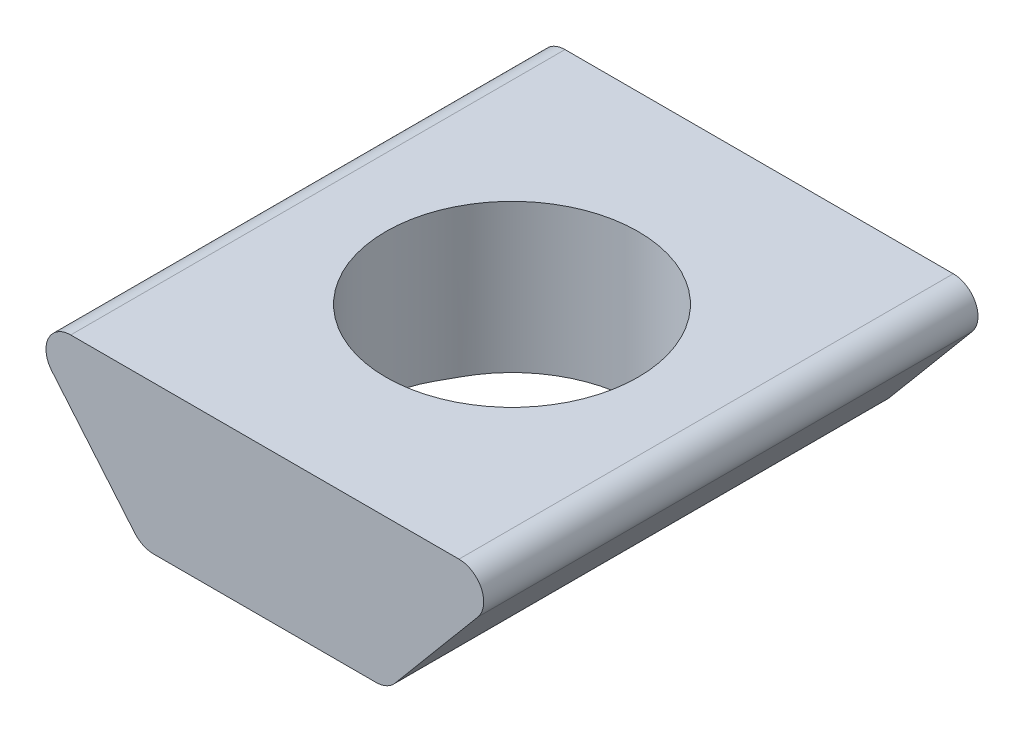
ISO-10303-21;
HEADER;
FILE_DESCRIPTION(('STEP AP214'),'2;1');
FILE_NAME('part.step','',(''),(''),'','','');
FILE_SCHEMA(('AUTOMOTIVE_DESIGN { 1 0 10303 214 1 1 1 1 }'));
ENDSEC;
DATA;
#1=APPLICATION_CONTEXT('core data for automotive mechanical design processes');
#2=APPLICATION_PROTOCOL_DEFINITION('international standard','automotive_design',2000,#1);
#3=PRODUCT_CONTEXT('',#1,'mechanical');
#4=PRODUCT('Part','Part','',(#3));
#5=PRODUCT_RELATED_PRODUCT_CATEGORY('part','',(#4));
#6=PRODUCT_DEFINITION_FORMATION('','',#4);
#7=PRODUCT_DEFINITION_CONTEXT('part definition',#1,'design');
#8=PRODUCT_DEFINITION('design','',#6,#7);
#9=PRODUCT_DEFINITION_SHAPE('','',#8);
#10=(LENGTH_UNIT() NAMED_UNIT(*) SI_UNIT(.MILLI.,.METRE.));
#11=(NAMED_UNIT(*) PLANE_ANGLE_UNIT() SI_UNIT($,.RADIAN.));
#12=(NAMED_UNIT(*) SI_UNIT($,.STERADIAN.) SOLID_ANGLE_UNIT());
#13=UNCERTAINTY_MEASURE_WITH_UNIT(LENGTH_MEASURE(1.E-05),#10,'distance_accuracy_value','');
#14=(GEOMETRIC_REPRESENTATION_CONTEXT(3) GLOBAL_UNCERTAINTY_ASSIGNED_CONTEXT((#13)) GLOBAL_UNIT_ASSIGNED_CONTEXT((#10,
#11,#12)) REPRESENTATION_CONTEXT('',''));
#15=CARTESIAN_POINT('',(0.,0.,0.));
#16=DIRECTION('',(0.,0.,1.));
#17=DIRECTION('',(1.,0.,0.));
#18=AXIS2_PLACEMENT_3D('',#15,#16,#17);
#19=CARTESIAN_POINT('',(2.48270110646813,-3.,10.));
#20=DIRECTION('',(0.,1.,0.));
#21=DIRECTION('',(-1.,0.,0.));
#22=AXIS2_PLACEMENT_3D('',#19,#20,#21);
#23=PLANE('',#22);
#24=DIRECTION('',(1.,0.,0.));
#25=VECTOR('',#24,1.);
#26=CARTESIAN_POINT('',(2.48270110646813,-3.,0.));
#27=LINE('',#26,#25);
#28=CARTESIAN_POINT('',(-2.24954727739063,-3.,0.));
#29=VERTEX_POINT('',#28);
#30=CARTESIAN_POINT('',(2.24954727739063,-3.,0.));
#31=VERTEX_POINT('',#30);
#32=EDGE_CURVE('E159',#29,#31,#27,.T.);
#33=ORIENTED_EDGE('',*,*,#32,.T.);
#34=DIRECTION('',(0.,0.,-1.));
#35=VECTOR('',#34,1.);
#36=CARTESIAN_POINT('',(2.24954727739063,-3.,1.89671434278934));
#37=LINE('',#36,#35);
#38=CARTESIAN_POINT('',(2.24954727739063,-3.,3.79342868557868));
#39=VERTEX_POINT('',#38);
#40=EDGE_CURVE('E124',#31,#39,#37,.F.);
#41=ORIENTED_EDGE('',*,*,#40,.T.);
#42=CARTESIAN_POINT('',(0.,-3.,5.));
#43=DIRECTION('',(0.,1.,0.));
#44=DIRECTION('',(0.,0.,1.));
#45=AXIS2_PLACEMENT_3D('',#42,#43,#44);
#46=CIRCLE('',#45,2.5527);
#47=CARTESIAN_POINT('',(-2.24954727739063,-3.,3.79342868557868));
#48=VERTEX_POINT('',#47);
#49=EDGE_CURVE('E161',#39,#48,#46,.T.);
#50=ORIENTED_EDGE('',*,*,#49,.T.);
#51=DIRECTION('',(0.,0.,-1.));
#52=VECTOR('',#51,1.);
#53=CARTESIAN_POINT('',(-2.24954727739063,-3.,1.89671434278934));
#54=LINE('',#53,#52);
#55=EDGE_CURVE('E129',#48,#29,#54,.T.);
#56=ORIENTED_EDGE('',*,*,#55,.T.);
#57=EDGE_LOOP('',(#33,#41,#50,#56));
#58=FACE_BOUND('',#57,.T.);
#59=ADVANCED_FACE('F39',(#58),#23,.F.);
#60=CARTESIAN_POINT('',(5.,0.,10.));
#61=DIRECTION('',(-0.766044443118974,0.642787609686544,0.));
#62=DIRECTION('',(-0.642787609686544,-0.766044443118974,0.));
#63=AXIS2_PLACEMENT_3D('',#60,#61,#62);
#64=PLANE('',#63);
#65=DIRECTION('',(0.642787609686543,0.766044443118974,0.));
#66=VECTOR('',#65,1.);
#67=CARTESIAN_POINT('',(5.,0.,10.));
#68=LINE('',#67,#66);
#69=CARTESIAN_POINT('',(2.63256949895012,-2.82139380484327,10.));
#70=VERTEX_POINT('',#69);
#71=CARTESIAN_POINT('',(4.3107687613047,-0.821393804843272,10.));
#72=VERTEX_POINT('',#71);
#73=EDGE_CURVE('E139',#70,#72,#68,.T.);
#74=ORIENTED_EDGE('',*,*,#73,.F.);
#75=DIRECTION('',(0.,0.,-1.));
#76=VECTOR('',#75,1.);
#77=CARTESIAN_POINT('',(2.63256949895012,-2.82139380484327,10.));
#78=LINE('',#77,#76);
#79=CARTESIAN_POINT('',(2.63256949895012,-2.82139380484327,0.));
#80=VERTEX_POINT('',#79);
#81=EDGE_CURVE('E122',#70,#80,#78,.T.);
#82=ORIENTED_EDGE('',*,*,#81,.T.);
#83=DIRECTION('',(0.642787609686543,0.766044443118974,0.));
#84=VECTOR('',#83,1.);
#85=CARTESIAN_POINT('',(5.,0.,0.));
#86=LINE('',#85,#84);
#87=CARTESIAN_POINT('',(4.3107687613047,-0.821393804843272,0.));
#88=VERTEX_POINT('',#87);
#89=EDGE_CURVE('E136',#80,#88,#86,.T.);
#90=ORIENTED_EDGE('',*,*,#89,.T.);
#91=DIRECTION('',(0.,0.,-1.));
#92=VECTOR('',#91,1.);
#93=CARTESIAN_POINT('',(4.3107687613047,-0.821393804843272,10.));
#94=LINE('',#93,#92);
#95=EDGE_CURVE('E141',#88,#72,#94,.F.);
#96=ORIENTED_EDGE('',*,*,#95,.T.);
#97=EDGE_LOOP('',(#74,#82,#90,#96));
#98=FACE_BOUND('',#97,.T.);
#99=ADVANCED_FACE('F135',(#98),#64,.F.);
#100=CARTESIAN_POINT('',(-5.,0.,10.));
#101=DIRECTION('',(0.,-1.,0.));
#102=DIRECTION('',(0.,0.,-1.));
#103=AXIS2_PLACEMENT_3D('',#100,#101,#102);
#104=PLANE('',#103);
#105=CARTESIAN_POINT('',(0.,0.,5.));
#106=DIRECTION('',(0.,1.,0.));
#107=DIRECTION('',(0.,0.,1.));
#108=AXIS2_PLACEMENT_3D('',#105,#106,#107);
#109=CIRCLE('',#108,2.5527);
#110=CARTESIAN_POINT('',(0.,0.,7.5527));
#111=VERTEX_POINT('',#110);
#112=EDGE_CURVE('E147',#111,#111,#109,.T.);
#113=ORIENTED_EDGE('',*,*,#112,.F.);
#114=EDGE_LOOP('',(#113));
#115=FACE_BOUND('',#114,.T.);
#116=DIRECTION('',(-1.,0.,0.));
#117=VECTOR('',#116,1.);
#118=CARTESIAN_POINT('',(-5.,0.,10.));
#119=LINE('',#118,#117);
#120=CARTESIAN_POINT('',(3.92774653974521,0.,10.));
#121=VERTEX_POINT('',#120);
#122=CARTESIAN_POINT('',(-3.92774653974521,0.,10.));
#123=VERTEX_POINT('',#122);
#124=EDGE_CURVE('E251',#121,#123,#119,.T.);
#125=ORIENTED_EDGE('',*,*,#124,.F.);
#126=DIRECTION('',(0.,0.,-1.));
#127=VECTOR('',#126,1.);
#128=CARTESIAN_POINT('',(3.92774653974521,0.,10.));
#129=LINE('',#128,#127);
#130=CARTESIAN_POINT('',(3.92774653974521,0.,0.));
#131=VERTEX_POINT('',#130);
#132=EDGE_CURVE('E11',#121,#131,#129,.T.);
#133=ORIENTED_EDGE('',*,*,#132,.T.);
#134=DIRECTION('',(-1.,0.,0.));
#135=VECTOR('',#134,1.);
#136=CARTESIAN_POINT('',(-5.,0.,0.));
#137=LINE('',#136,#135);
#138=CARTESIAN_POINT('',(-3.92774653974521,0.,0.));
#139=VERTEX_POINT('',#138);
#140=EDGE_CURVE('E146',#131,#139,#137,.T.);
#141=ORIENTED_EDGE('',*,*,#140,.T.);
#142=DIRECTION('',(0.,0.,-1.));
#143=VECTOR('',#142,1.);
#144=CARTESIAN_POINT('',(-3.92774653974521,0.,10.));
#145=LINE('',#144,#143);
#146=EDGE_CURVE('E47',#139,#123,#145,.F.);
#147=ORIENTED_EDGE('',*,*,#146,.T.);
#148=EDGE_LOOP('',(#125,#133,#141,#147));
#149=FACE_BOUND('',#148,.T.);
#150=ADVANCED_FACE('F203',(#115,#149),#104,.F.);
#151=CARTESIAN_POINT('',(-2.48270110646813,-3.,10.));
#152=DIRECTION('',(0.766044443118974,0.642787609686544,0.));
#153=DIRECTION('',(-0.642787609686544,0.766044443118974,0.));
#154=AXIS2_PLACEMENT_3D('',#151,#152,#153);
#155=PLANE('',#154);
#156=DIRECTION('',(0.642787609686544,-0.766044443118974,0.));
#157=VECTOR('',#156,1.);
#158=CARTESIAN_POINT('',(-2.48270110646813,-3.,0.));
#159=LINE('',#158,#157);
#160=CARTESIAN_POINT('',(-4.3107687613047,-0.821393804843272,0.));
#161=VERTEX_POINT('',#160);
#162=CARTESIAN_POINT('',(-2.63256949895012,-2.82139380484327,0.));
#163=VERTEX_POINT('',#162);
#164=EDGE_CURVE('E150',#161,#163,#159,.T.);
#165=ORIENTED_EDGE('',*,*,#164,.T.);
#166=DIRECTION('',(0.,0.,-1.));
#167=VECTOR('',#166,1.);
#168=CARTESIAN_POINT('',(-2.63256949895012,-2.82139380484327,10.));
#169=LINE('',#168,#167);
#170=CARTESIAN_POINT('',(-2.63256949895012,-2.82139380484327,10.));
#171=VERTEX_POINT('',#170);
#172=EDGE_CURVE('E54',#163,#171,#169,.F.);
#173=ORIENTED_EDGE('',*,*,#172,.T.);
#174=DIRECTION('',(0.642787609686544,-0.766044443118974,0.));
#175=VECTOR('',#174,1.);
#176=CARTESIAN_POINT('',(-2.48270110646813,-3.,10.));
#177=LINE('',#176,#175);
#178=CARTESIAN_POINT('',(-4.3107687613047,-0.821393804843272,10.));
#179=VERTEX_POINT('',#178);
#180=EDGE_CURVE('E250',#179,#171,#177,.T.);
#181=ORIENTED_EDGE('',*,*,#180,.F.);
#182=DIRECTION('',(0.,0.,-1.));
#183=VECTOR('',#182,1.);
#184=CARTESIAN_POINT('',(-4.3107687613047,-0.821393804843272,10.));
#185=LINE('',#184,#183);
#186=EDGE_CURVE('E227',#179,#161,#185,.T.);
#187=ORIENTED_EDGE('',*,*,#186,.T.);
#188=EDGE_LOOP('',(#165,#173,#181,#187));
#189=FACE_BOUND('',#188,.T.);
#190=ADVANCED_FACE('F199',(#189),#155,.F.);
#191=CARTESIAN_POINT('',(-2.24954727739063,-3.,6.20657131442132));
#192=VERTEX_POINT('',#191);
#193=CARTESIAN_POINT('',(2.24954727739063,-3.,6.20657131442132));
#194=VERTEX_POINT('',#193);
#195=EDGE_CURVE('E245',#192,#194,#46,.T.);
#196=ORIENTED_EDGE('',*,*,#195,.T.);
#197=DIRECTION('',(0.,0.,-1.));
#198=VECTOR('',#197,1.);
#199=CARTESIAN_POINT('',(2.24954727739063,-3.,10.));
#200=LINE('',#199,#198);
#201=CARTESIAN_POINT('',(2.24954727739063,-3.,10.));
#202=VERTEX_POINT('',#201);
#203=EDGE_CURVE('E238',#194,#202,#200,.F.);
#204=ORIENTED_EDGE('',*,*,#203,.T.);
#205=DIRECTION('',(1.,0.,0.));
#206=VECTOR('',#205,1.);
#207=CARTESIAN_POINT('',(2.48270110646813,-3.,10.));
#208=LINE('',#207,#206);
#209=CARTESIAN_POINT('',(-2.24954727739063,-3.,10.));
#210=VERTEX_POINT('',#209);
#211=EDGE_CURVE('E155',#210,#202,#208,.T.);
#212=ORIENTED_EDGE('',*,*,#211,.F.);
#213=DIRECTION('',(0.,0.,-1.));
#214=VECTOR('',#213,1.);
#215=CARTESIAN_POINT('',(-2.24954727739063,-3.,10.));
#216=LINE('',#215,#214);
#217=EDGE_CURVE('E239',#210,#192,#216,.T.);
#218=ORIENTED_EDGE('',*,*,#217,.T.);
#219=EDGE_LOOP('',(#196,#204,#212,#218));
#220=FACE_BOUND('',#219,.T.);
#221=ADVANCED_FACE('F194',(#220),#23,.F.);
#222=CARTESIAN_POINT('',(0.,0.,10.));
#223=DIRECTION('',(0.,0.,-1.));
#224=DIRECTION('',(-1.,0.,0.));
#225=AXIS2_PLACEMENT_3D('',#222,#223,#224);
#226=PLANE('',#225);
#227=ORIENTED_EDGE('',*,*,#211,.T.);
#228=CARTESIAN_POINT('',(2.24954727739063,-2.5,10.));
#229=DIRECTION('',(0.,0.,-1.));
#230=DIRECTION('',(-1.,0.,0.));
#231=AXIS2_PLACEMENT_3D('',#228,#229,#230);
#232=CIRCLE('',#231,0.5);
#233=EDGE_CURVE('E230',#202,#70,#232,.F.);
#234=ORIENTED_EDGE('',*,*,#233,.T.);
#235=ORIENTED_EDGE('',*,*,#73,.T.);
#236=CARTESIAN_POINT('',(3.92774653974521,-0.5,10.));
#237=DIRECTION('',(0.,0.,-1.));
#238=DIRECTION('',(-1.,0.,0.));
#239=AXIS2_PLACEMENT_3D('',#236,#237,#238);
#240=CIRCLE('',#239,0.5);
#241=EDGE_CURVE('E235',#72,#121,#240,.F.);
#242=ORIENTED_EDGE('',*,*,#241,.T.);
#243=ORIENTED_EDGE('',*,*,#124,.T.);
#244=CARTESIAN_POINT('',(-3.92774653974521,-0.5,10.));
#245=DIRECTION('',(0.,0.,-1.));
#246=DIRECTION('',(-1.,0.,0.));
#247=AXIS2_PLACEMENT_3D('',#244,#245,#246);
#248=CIRCLE('',#247,0.5);
#249=EDGE_CURVE('E61',#123,#179,#248,.F.);
#250=ORIENTED_EDGE('',*,*,#249,.T.);
#251=ORIENTED_EDGE('',*,*,#180,.T.);
#252=CARTESIAN_POINT('',(-2.24954727739063,-2.5,10.));
#253=DIRECTION('',(0.,0.,-1.));
#254=DIRECTION('',(-1.,0.,0.));
#255=AXIS2_PLACEMENT_3D('',#252,#253,#254);
#256=CIRCLE('',#255,0.5);
#257=EDGE_CURVE('E226',#171,#210,#256,.F.);
#258=ORIENTED_EDGE('',*,*,#257,.T.);
#259=EDGE_LOOP('',(#227,#234,#235,#242,#243,#250,#251,#258));
#260=FACE_BOUND('',#259,.T.);
#261=ADVANCED_FACE('F190',(#260),#226,.F.);
#262=CARTESIAN_POINT('',(0.,0.,0.));
#263=DIRECTION('',(0.,0.,-1.));
#264=DIRECTION('',(-1.,0.,0.));
#265=AXIS2_PLACEMENT_3D('',#262,#263,#264);
#266=PLANE('',#265);
#267=ORIENTED_EDGE('',*,*,#89,.F.);
#268=CARTESIAN_POINT('',(2.24954727739063,-2.5,0.));
#269=DIRECTION('',(0.,0.,-1.));
#270=DIRECTION('',(-1.,0.,0.));
#271=AXIS2_PLACEMENT_3D('',#268,#269,#270);
#272=CIRCLE('',#271,0.5);
#273=EDGE_CURVE('E118',#80,#31,#272,.T.);
#274=ORIENTED_EDGE('',*,*,#273,.T.);
#275=ORIENTED_EDGE('',*,*,#32,.F.);
#276=CARTESIAN_POINT('',(-2.24954727739063,-2.5,0.));
#277=DIRECTION('',(0.,0.,-1.));
#278=DIRECTION('',(-1.,0.,0.));
#279=AXIS2_PLACEMENT_3D('',#276,#277,#278);
#280=CIRCLE('',#279,0.5);
#281=EDGE_CURVE('E130',#29,#163,#280,.T.);
#282=ORIENTED_EDGE('',*,*,#281,.T.);
#283=ORIENTED_EDGE('',*,*,#164,.F.);
#284=CARTESIAN_POINT('',(-3.92774653974521,-0.5,0.));
#285=DIRECTION('',(0.,0.,-1.));
#286=DIRECTION('',(-1.,0.,0.));
#287=AXIS2_PLACEMENT_3D('',#284,#285,#286);
#288=CIRCLE('',#287,0.5);
#289=EDGE_CURVE('E140',#161,#139,#288,.T.);
#290=ORIENTED_EDGE('',*,*,#289,.T.);
#291=ORIENTED_EDGE('',*,*,#140,.F.);
#292=CARTESIAN_POINT('',(3.92774653974521,-0.5,0.));
#293=DIRECTION('',(0.,0.,-1.));
#294=DIRECTION('',(-1.,0.,0.));
#295=AXIS2_PLACEMENT_3D('',#292,#293,#294);
#296=CIRCLE('',#295,0.5);
#297=EDGE_CURVE('E145',#131,#88,#296,.T.);
#298=ORIENTED_EDGE('',*,*,#297,.T.);
#299=EDGE_LOOP('',(#267,#274,#275,#282,#283,#290,#291,#298));
#300=FACE_BOUND('',#299,.T.);
#301=ADVANCED_FACE('F143',(#300),#266,.T.);
#302=CARTESIAN_POINT('',(0.,0.,5.));
#303=DIRECTION('',(0.,1.,0.));
#304=DIRECTION('',(0.,0.,1.));
#305=AXIS2_PLACEMENT_3D('',#302,#303,#304);
#306=CYLINDRICAL_SURFACE('',#305,2.5527);
#307=ORIENTED_EDGE('',*,*,#112,.T.);
#308=EDGE_LOOP('',(#307));
#309=FACE_BOUND('',#308,.T.);
#310=ORIENTED_EDGE('',*,*,#49,.F.);
#311=CARTESIAN_POINT('',(2.24954727739063,-3.,3.79342868557868));
#312=CARTESIAN_POINT('',(2.26394333269422,-2.99999616646399,3.82026775677088));
#313=CARTESIAN_POINT('',(2.27785283940401,-2.99937878175297,3.84735513824156));
#314=CARTESIAN_POINT('',(2.30467322681855,-2.99713473155878,3.90196407292806));
#315=CARTESIAN_POINT('',(2.3175845800956,-2.99550854702044,3.92948541316438));
#316=CARTESIAN_POINT('',(2.35475261650152,-2.98945039602383,4.01253286015282));
#317=CARTESIAN_POINT('',(2.37750190025478,-2.98383704407472,4.06865182302734));
#318=CARTESIAN_POINT('',(2.41902821818082,-2.97090485578815,4.18251766707894));
#319=CARTESIAN_POINT('',(2.43778010202598,-2.96357579671352,4.2402724065789));
#320=CARTESIAN_POINT('',(2.47112797255901,-2.94859352905436,4.35696935467399));
#321=CARTESIAN_POINT('',(2.48572119644286,-2.94094010884039,4.41591232496174));
#322=CARTESIAN_POINT('',(2.51163831828933,-2.9260854617955,4.53932541380912));
#323=CARTESIAN_POINT('',(2.52263020160855,-2.91896258867281,4.60387560582954));
#324=CARTESIAN_POINT('',(2.53963270626796,-2.90737959529724,4.73385298841238));
#325=CARTESIAN_POINT('',(2.54564564057167,-2.9029182389102,4.79927975739154));
#326=CARTESIAN_POINT('',(2.55258769929953,-2.89772694141458,4.93030194156086));
#327=CARTESIAN_POINT('',(2.55353693864029,-2.89698223711581,4.99589565235497));
#328=CARTESIAN_POINT('',(2.55038632246802,-2.89937335924134,5.12689076829201));
#329=CARTESIAN_POINT('',(2.54628591369394,-2.90250961087994,5.1922921515757));
#330=CARTESIAN_POINT('',(2.53356094432142,-2.91157109604914,5.31788918199906));
#331=CARTESIAN_POINT('',(2.52526599216346,-2.91729027465849,5.37813419947086));
#332=CARTESIAN_POINT('',(2.50444431817574,-2.9303222076145,5.49772158883407));
#333=CARTESIAN_POINT('',(2.49191483904816,-2.93763599918394,5.5570633461926));
#334=CARTESIAN_POINT('',(2.44803216005291,-2.96009702168079,5.73355435076077));
#335=CARTESIAN_POINT('',(2.41038191322207,-2.9757669584953,5.849196732505));
#336=CARTESIAN_POINT('',(2.34758625049984,-2.99060232913142,6.00356423679641));
#337=CARTESIAN_POINT('',(2.32950954063785,-2.99394588960945,6.04484214160036));
#338=CARTESIAN_POINT('',(2.2911642370984,-2.99863584477923,6.12644388267942));
#339=CARTESIAN_POINT('',(2.27089711190133,-2.9999835687008,6.16676833632604));
#340=CARTESIAN_POINT('',(2.24954727739063,-3.,6.20657131442132));
#341=B_SPLINE_CURVE_WITH_KNOTS('',3,(#311,#312,#313,#314,#315,#316,#317,#318,#319,#320,#321,
#322,#323,#324,#325,#326,#327,#328,#329,#330,#331,#332,#333,#334,#335,#336,#337,#338,#339,#340),
.UNSPECIFIED.,.F.,.F.,(4,2,2,2,2,2,2,2,2,2,2,2,2,2,4),(0.,0.0913401879634082,0.182636862968259,
0.364859175440238,0.548196178293615,0.731654698561806,0.929031164247534,1.12631588746071,
1.32281633414993,1.51933831218418,1.7023806108155,1.8855423271886,2.25178327739338,
2.38725713885052,2.52264073389317),.UNSPECIFIED.);
#342=EDGE_CURVE('E176',#39,#194,#341,.T.);
#343=ORIENTED_EDGE('',*,*,#342,.T.);
#344=ORIENTED_EDGE('',*,*,#195,.F.);
#345=CARTESIAN_POINT('',(-2.24954727739063,-3.,6.20657131442132));
#346=CARTESIAN_POINT('',(-2.26394333269422,-2.99999616646399,6.17973224322912));
#347=CARTESIAN_POINT('',(-2.27785283940401,-2.99937878175297,6.15264486175844));
#348=CARTESIAN_POINT('',(-2.30467322681855,-2.99713473155879,6.09803592707194));
#349=CARTESIAN_POINT('',(-2.3175845800956,-2.99550854702045,6.07051458683562));
#350=CARTESIAN_POINT('',(-2.35475261650152,-2.98945039602383,5.98746713984718));
#351=CARTESIAN_POINT('',(-2.37750190025478,-2.98383704407472,5.93134817697266));
#352=CARTESIAN_POINT('',(-2.41902821818082,-2.97090485578815,5.81748233292106));
#353=CARTESIAN_POINT('',(-2.43778010202598,-2.96357579671353,5.75972759342109));
#354=CARTESIAN_POINT('',(-2.47112797255901,-2.94859352905436,5.64303064532601));
#355=CARTESIAN_POINT('',(-2.48572119644286,-2.94094010884039,5.58408767503826));
#356=CARTESIAN_POINT('',(-2.51163831828933,-2.9260854617955,5.46067458619088));
#357=CARTESIAN_POINT('',(-2.52263020160855,-2.91896258867281,5.39612439417045));
#358=CARTESIAN_POINT('',(-2.53963270626796,-2.90737959529724,5.26614701158761));
#359=CARTESIAN_POINT('',(-2.54564564057167,-2.9029182389102,5.20072024260846));
#360=CARTESIAN_POINT('',(-2.55258769929953,-2.89772694141458,5.06969805843914));
#361=CARTESIAN_POINT('',(-2.55353693864029,-2.89698223711582,5.00410434764503));
#362=CARTESIAN_POINT('',(-2.55038632246802,-2.89937335924134,4.87310923170798));
#363=CARTESIAN_POINT('',(-2.54628591369394,-2.90250961087995,4.80770784842429));
#364=CARTESIAN_POINT('',(-2.53356094432141,-2.91157109604914,4.68211081800094));
#365=CARTESIAN_POINT('',(-2.52526599216346,-2.91729027465849,4.62186580052914));
#366=CARTESIAN_POINT('',(-2.50444431817574,-2.9303222076145,4.50227841116592));
#367=CARTESIAN_POINT('',(-2.49191483904816,-2.93763599918394,4.4429366538074));
#368=CARTESIAN_POINT('',(-2.44803216005291,-2.96009702168079,4.26644564923923));
#369=CARTESIAN_POINT('',(-2.41038191322207,-2.9757669584953,4.150803267495));
#370=CARTESIAN_POINT('',(-2.34758625049983,-2.99060232913142,3.99643576320359));
#371=CARTESIAN_POINT('',(-2.32950954063785,-2.99394588960945,3.95515785839964));
#372=CARTESIAN_POINT('',(-2.2911642370984,-2.99863584477923,3.87355611732058));
#373=CARTESIAN_POINT('',(-2.27089711190133,-2.9999835687008,3.83323166367396));
#374=CARTESIAN_POINT('',(-2.24954727739063,-3.,3.79342868557868));
#375=B_SPLINE_CURVE_WITH_KNOTS('',3,(#345,#346,#347,#348,#349,#350,#351,#352,#353,#354,#355,
#356,#357,#358,#359,#360,#361,#362,#363,#364,#365,#366,#367,#368,#369,#370,#371,#372,#373,#374),
.UNSPECIFIED.,.F.,.F.,(4,2,2,2,2,2,2,2,2,2,2,2,2,2,4),(0.,0.0913401879634086,0.18263686296826,
0.364859175440239,0.548196178293618,0.731654698561808,0.92903116424754,1.12631588746072,
1.32281633414994,1.51933831218419,1.70238061081551,1.8855423271886,2.25178327739338,
2.38725713885052,2.52264073389316),.UNSPECIFIED.);
#376=EDGE_CURVE('E168',#192,#48,#375,.T.);
#377=ORIENTED_EDGE('',*,*,#376,.T.);
#378=EDGE_LOOP('',(#310,#343,#344,#377));
#379=FACE_BOUND('',#378,.T.);
#380=ADVANCED_FACE('F185',(#309,#379),#306,.F.);
#381=CARTESIAN_POINT('',(2.24954727739063,-2.5,10.));
#382=DIRECTION('',(0.,0.,-1.));
#383=DIRECTION('',(-1.,0.,0.));
#384=AXIS2_PLACEMENT_3D('',#381,#382,#383);
#385=CYLINDRICAL_SURFACE('',#384,0.5);
#386=ORIENTED_EDGE('',*,*,#233,.F.);
#387=ORIENTED_EDGE('',*,*,#203,.F.);
#388=ORIENTED_EDGE('',*,*,#342,.F.);
#389=ORIENTED_EDGE('',*,*,#40,.F.);
#390=ORIENTED_EDGE('',*,*,#273,.F.);
#391=ORIENTED_EDGE('',*,*,#81,.F.);
#392=EDGE_LOOP('',(#386,#387,#388,#389,#390,#391));
#393=FACE_BOUND('',#392,.T.);
#394=ADVANCED_FACE('F121',(#393),#385,.T.);
#395=CARTESIAN_POINT('',(-2.24954727739063,-2.5,10.));
#396=DIRECTION('',(0.,0.,-1.));
#397=DIRECTION('',(-1.,0.,0.));
#398=AXIS2_PLACEMENT_3D('',#395,#396,#397);
#399=CYLINDRICAL_SURFACE('',#398,0.5);
#400=ORIENTED_EDGE('',*,*,#257,.F.);
#401=ORIENTED_EDGE('',*,*,#172,.F.);
#402=ORIENTED_EDGE('',*,*,#281,.F.);
#403=ORIENTED_EDGE('',*,*,#55,.F.);
#404=ORIENTED_EDGE('',*,*,#376,.F.);
#405=ORIENTED_EDGE('',*,*,#217,.F.);
#406=EDGE_LOOP('',(#400,#401,#402,#403,#404,#405));
#407=FACE_BOUND('',#406,.T.);
#408=ADVANCED_FACE('F183',(#407),#399,.T.);
#409=CARTESIAN_POINT('',(3.92774653974521,-0.5,10.));
#410=DIRECTION('',(0.,0.,-1.));
#411=DIRECTION('',(-1.,0.,0.));
#412=AXIS2_PLACEMENT_3D('',#409,#410,#411);
#413=CYLINDRICAL_SURFACE('',#412,0.5);
#414=ORIENTED_EDGE('',*,*,#241,.F.);
#415=ORIENTED_EDGE('',*,*,#95,.F.);
#416=ORIENTED_EDGE('',*,*,#297,.F.);
#417=ORIENTED_EDGE('',*,*,#132,.F.);
#418=EDGE_LOOP('',(#414,#415,#416,#417));
#419=FACE_BOUND('',#418,.T.);
#420=ADVANCED_FACE('F213',(#419),#413,.T.);
#421=CARTESIAN_POINT('',(-3.92774653974521,-0.5,10.));
#422=DIRECTION('',(0.,0.,-1.));
#423=DIRECTION('',(-1.,0.,0.));
#424=AXIS2_PLACEMENT_3D('',#421,#422,#423);
#425=CYLINDRICAL_SURFACE('',#424,0.5);
#426=ORIENTED_EDGE('',*,*,#249,.F.);
#427=ORIENTED_EDGE('',*,*,#146,.F.);
#428=ORIENTED_EDGE('',*,*,#289,.F.);
#429=ORIENTED_EDGE('',*,*,#186,.F.);
#430=EDGE_LOOP('',(#426,#427,#428,#429));
#431=FACE_BOUND('',#430,.T.);
#432=ADVANCED_FACE('F41',(#431),#425,.T.);
#433=CLOSED_SHELL('',(#59,#99,#150,#190,#221,#261,#301,#380,#394,#408,#420,#432));
#434=MANIFOLD_SOLID_BREP('B2',#433);
#435=ADVANCED_BREP_SHAPE_REPRESENTATION('',(#18,#434),#14);
#436=SHAPE_DEFINITION_REPRESENTATION(#9,#435);
ENDSEC;
END-ISO-10303-21;
